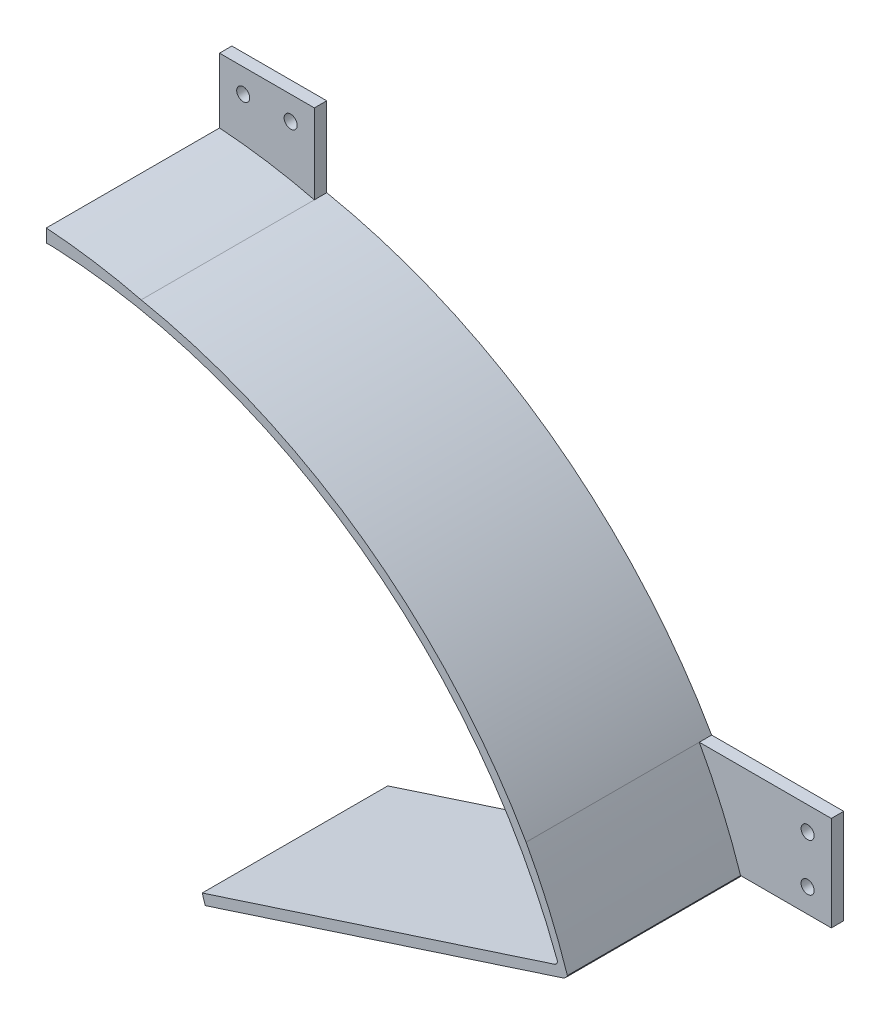
ISO-10303-21;
HEADER;
FILE_DESCRIPTION(('STEP AP214'),'2;1');
FILE_NAME('part.step','',(''),(''),'','','');
FILE_SCHEMA(('AUTOMOTIVE_DESIGN { 1 0 10303 214 1 1 1 1 }'));
ENDSEC;
DATA;
#1=APPLICATION_CONTEXT('core data for automotive mechanical design processes');
#2=APPLICATION_PROTOCOL_DEFINITION('international standard','automotive_design',2000,#1);
#3=PRODUCT_CONTEXT('',#1,'mechanical');
#4=PRODUCT('Part','Part','',(#3));
#5=PRODUCT_RELATED_PRODUCT_CATEGORY('part','',(#4));
#6=PRODUCT_DEFINITION_FORMATION('','',#4);
#7=PRODUCT_DEFINITION_CONTEXT('part definition',#1,'design');
#8=PRODUCT_DEFINITION('design','',#6,#7);
#9=PRODUCT_DEFINITION_SHAPE('','',#8);
#10=(LENGTH_UNIT() NAMED_UNIT(*) SI_UNIT(.MILLI.,.METRE.));
#11=(NAMED_UNIT(*) PLANE_ANGLE_UNIT() SI_UNIT($,.RADIAN.));
#12=(NAMED_UNIT(*) SI_UNIT($,.STERADIAN.) SOLID_ANGLE_UNIT());
#13=UNCERTAINTY_MEASURE_WITH_UNIT(LENGTH_MEASURE(1.E-05),#10,'distance_accuracy_value','');
#14=(GEOMETRIC_REPRESENTATION_CONTEXT(3) GLOBAL_UNCERTAINTY_ASSIGNED_CONTEXT((#13)) GLOBAL_UNIT_ASSIGNED_CONTEXT((#10,
#11,#12)) REPRESENTATION_CONTEXT('',''));
#15=CARTESIAN_POINT('',(0.,0.,0.));
#16=DIRECTION('',(0.,0.,1.));
#17=DIRECTION('',(1.,0.,0.));
#18=AXIS2_PLACEMENT_3D('',#15,#16,#17);
#19=CARTESIAN_POINT('',(-232.100209696536,-162.556464261133,5.));
#20=DIRECTION('',(0.,0.,1.));
#21=DIRECTION('',(1.,0.,0.));
#22=AXIS2_PLACEMENT_3D('',#19,#20,#21);
#23=PLANE('',#22);
#24=CARTESIAN_POINT('',(12.295289669307,-57.5910822865237,5.));
#25=DIRECTION('',(0.,0.,1.));
#26=DIRECTION('',(1.,0.,0.));
#27=AXIS2_PLACEMENT_3D('',#24,#25,#26);
#28=CIRCLE('',#27,2.63563773825907);
#29=CARTESIAN_POINT('',(14.9309274075661,-57.5910822865237,5.));
#30=VERTEX_POINT('',#29);
#31=EDGE_CURVE('E297',#30,#30,#28,.T.);
#32=ORIENTED_EDGE('',*,*,#31,.F.);
#33=EDGE_LOOP('',(#32));
#34=FACE_BOUND('',#33,.T.);
#35=CARTESIAN_POINT('',(12.295289669307,-76.7593567465898,5.));
#36=DIRECTION('',(0.,0.,1.));
#37=DIRECTION('',(1.,0.,0.));
#38=AXIS2_PLACEMENT_3D('',#35,#36,#37);
#39=CIRCLE('',#38,2.63563773825908);
#40=CARTESIAN_POINT('',(14.9309274075661,-76.7593567465898,5.));
#41=VERTEX_POINT('',#40);
#42=EDGE_CURVE('E303',#41,#41,#39,.T.);
#43=ORIENTED_EDGE('',*,*,#42,.F.);
#44=EDGE_LOOP('',(#43));
#45=FACE_BOUND('',#44,.T.);
#46=DIRECTION('',(-1.,0.,0.));
#47=VECTOR('',#46,1.);
#48=CARTESIAN_POINT('',(21.8794268993401,-48.0069450564906,5.));
#49=LINE('',#48,#47);
#50=CARTESIAN_POINT('',(21.8794268993401,-48.0069450564906,5.));
#51=VERTEX_POINT('',#50);
#52=CARTESIAN_POINT('',(-31.4778838614387,-48.0069450564906,5.));
#53=VERTEX_POINT('',#52);
#54=EDGE_CURVE('E319',#51,#53,#49,.T.);
#55=ORIENTED_EDGE('',*,*,#54,.T.);
#56=CARTESIAN_POINT('',(-230.885671829601,-157.575462282154,5.));
#57=DIRECTION('',(0.,0.,1.));
#58=DIRECTION('',(1.,0.,0.));
#59=AXIS2_PLACEMENT_3D('',#56,#57,#58);
#60=CIRCLE('',#59,227.527417840985);
#61=CARTESIAN_POINT('',(-14.7960317246068,-86.3434939766229,5.));
#62=VERTEX_POINT('',#61);
#63=EDGE_CURVE('E184',#53,#62,#60,.F.);
#64=ORIENTED_EDGE('',*,*,#63,.T.);
#65=DIRECTION('',(1.,0.,0.));
#66=VECTOR('',#65,1.);
#67=CARTESIAN_POINT('',(-19.2512494401252,-86.3434939766229,5.));
#68=LINE('',#67,#66);
#69=CARTESIAN_POINT('',(21.8794268993401,-86.3434939766229,5.));
#70=VERTEX_POINT('',#69);
#71=EDGE_CURVE('E88',#62,#70,#68,.T.);
#72=ORIENTED_EDGE('',*,*,#71,.T.);
#73=DIRECTION('',(0.,1.,0.));
#74=VECTOR('',#73,1.);
#75=CARTESIAN_POINT('',(21.8794268993401,-48.0069450564906,5.));
#76=LINE('',#75,#74);
#77=EDGE_CURVE('E317',#70,#51,#76,.T.);
#78=ORIENTED_EDGE('',*,*,#77,.T.);
#79=EDGE_LOOP('',(#55,#64,#72,#78));
#80=FACE_BOUND('',#79,.T.);
#81=ADVANCED_FACE('F39',(#34,#45,#80),#23,.T.);
#82=DIRECTION('',(0.,-1.,0.));
#83=VECTOR('',#82,1.);
#84=CARTESIAN_POINT('',(-225.391313635513,64.7579829150162,5.));
#85=LINE('',#84,#83);
#86=CARTESIAN_POINT('',(-225.391313635513,96.21524094976,5.));
#87=VERTEX_POINT('',#86);
#88=CARTESIAN_POINT('',(-225.391313635513,70.0322881605736,5.));
#89=VERTEX_POINT('',#88);
#90=EDGE_CURVE('E231',#87,#89,#85,.T.);
#91=ORIENTED_EDGE('',*,*,#90,.T.);
#92=CARTESIAN_POINT('',(-241.284731317854,-156.939351353619,5.));
#93=DIRECTION('',(0.,0.,1.));
#94=DIRECTION('',(1.,0.,0.));
#95=AXIS2_PLACEMENT_3D('',#92,#93,#94);
#96=CIRCLE('',#95,227.527417840985);
#97=CARTESIAN_POINT('',(-187.054764715381,64.0308651726825,5.));
#98=VERTEX_POINT('',#97);
#99=EDGE_CURVE('E278',#89,#98,#96,.F.);
#100=ORIENTED_EDGE('',*,*,#99,.T.);
#101=DIRECTION('',(0.,1.,0.));
#102=VECTOR('',#101,1.);
#103=CARTESIAN_POINT('',(-187.054764715381,96.2152409497599,5.));
#104=LINE('',#103,#102);
#105=CARTESIAN_POINT('',(-187.054764715381,96.2152409497599,5.));
#106=VERTEX_POINT('',#105);
#107=EDGE_CURVE('E322',#98,#106,#104,.T.);
#108=ORIENTED_EDGE('',*,*,#107,.T.);
#109=DIRECTION('',(-1.,0.,0.));
#110=VECTOR('',#109,1.);
#111=CARTESIAN_POINT('',(-225.391313635513,96.21524094976,5.));
#112=LINE('',#111,#110);
#113=EDGE_CURVE('E56',#106,#87,#112,.T.);
#114=ORIENTED_EDGE('',*,*,#113,.T.);
#115=EDGE_LOOP('',(#91,#100,#108,#114));
#116=FACE_BOUND('',#115,.T.);
#117=CARTESIAN_POINT('',(-215.80717640548,86.6311037197273,5.));
#118=DIRECTION('',(0.,0.,1.));
#119=DIRECTION('',(1.,0.,0.));
#120=AXIS2_PLACEMENT_3D('',#117,#118,#119);
#121=CIRCLE('',#120,2.63563773825912);
#122=CARTESIAN_POINT('',(-213.171538667221,86.6311037197273,5.));
#123=VERTEX_POINT('',#122);
#124=EDGE_CURVE('E223',#123,#123,#121,.T.);
#125=ORIENTED_EDGE('',*,*,#124,.F.);
#126=EDGE_LOOP('',(#125));
#127=FACE_BOUND('',#126,.T.);
#128=CARTESIAN_POINT('',(-196.638901945414,86.6311037197273,5.));
#129=DIRECTION('',(0.,0.,1.));
#130=DIRECTION('',(1.,0.,0.));
#131=AXIS2_PLACEMENT_3D('',#128,#129,#130);
#132=CIRCLE('',#131,2.63563773825909);
#133=CARTESIAN_POINT('',(-194.003264207155,86.6311037197273,5.));
#134=VERTEX_POINT('',#133);
#135=EDGE_CURVE('E309',#134,#134,#132,.T.);
#136=ORIENTED_EDGE('',*,*,#135,.F.);
#137=EDGE_LOOP('',(#136));
#138=FACE_BOUND('',#137,.T.);
#139=ADVANCED_FACE('F323',(#116,#127,#138),#23,.T.);
#140=CARTESIAN_POINT('',(-232.100209696536,-162.556464261133,0.));
#141=DIRECTION('',(0.,0.,1.));
#142=DIRECTION('',(1.,0.,0.));
#143=AXIS2_PLACEMENT_3D('',#140,#141,#142);
#144=PLANE('',#143);
#145=DIRECTION('',(-1.,0.,0.));
#146=VECTOR('',#145,1.);
#147=CARTESIAN_POINT('',(-225.391313635513,96.21524094976,0.));
#148=LINE('',#147,#146);
#149=CARTESIAN_POINT('',(-187.054764715381,96.2152409497599,0.));
#150=VERTEX_POINT('',#149);
#151=CARTESIAN_POINT('',(-225.391313635513,96.21524094976,0.));
#152=VERTEX_POINT('',#151);
#153=EDGE_CURVE('E80',#150,#152,#148,.T.);
#154=ORIENTED_EDGE('',*,*,#153,.F.);
#155=DIRECTION('',(0.,1.,0.));
#156=VECTOR('',#155,1.);
#157=CARTESIAN_POINT('',(-187.054764715381,96.2152409497599,0.));
#158=LINE('',#157,#156);
#159=CARTESIAN_POINT('',(-187.054764715381,64.0308651726825,0.));
#160=VERTEX_POINT('',#159);
#161=EDGE_CURVE('E74',#160,#150,#158,.T.);
#162=ORIENTED_EDGE('',*,*,#161,.F.);
#163=CARTESIAN_POINT('',(-232.100209696536,-162.556464261133,0.));
#164=DIRECTION('',(0.,0.,1.));
#165=DIRECTION('',(1.,0.,0.));
#166=AXIS2_PLACEMENT_3D('',#163,#164,#165);
#167=CIRCLE('',#166,231.021449163273);
#168=CARTESIAN_POINT('',(-31.4778838614387,-48.0069450564906,0.));
#169=VERTEX_POINT('',#168);
#170=EDGE_CURVE('E339',#160,#169,#167,.F.);
#171=ORIENTED_EDGE('',*,*,#170,.T.);
#172=DIRECTION('',(-1.,0.,0.));
#173=VECTOR('',#172,1.);
#174=CARTESIAN_POINT('',(21.8794268993401,-48.0069450564906,0.));
#175=LINE('',#174,#173);
#176=CARTESIAN_POINT('',(21.8794268993401,-48.0069450564906,0.));
#177=VERTEX_POINT('',#176);
#178=EDGE_CURVE('E225',#177,#169,#175,.T.);
#179=ORIENTED_EDGE('',*,*,#178,.F.);
#180=DIRECTION('',(0.,1.,0.));
#181=VECTOR('',#180,1.);
#182=CARTESIAN_POINT('',(21.8794268993401,-48.0069450564906,0.));
#183=LINE('',#182,#181);
#184=CARTESIAN_POINT('',(21.8794268993401,-86.3434939766229,0.));
#185=VERTEX_POINT('',#184);
#186=EDGE_CURVE('E222',#185,#177,#183,.T.);
#187=ORIENTED_EDGE('',*,*,#186,.F.);
#188=DIRECTION('',(1.,0.,0.));
#189=VECTOR('',#188,1.);
#190=CARTESIAN_POINT('',(-19.2512494401252,-86.3434939766229,0.));
#191=LINE('',#190,#189);
#192=CARTESIAN_POINT('',(-14.7960317246068,-86.3434939766229,0.));
#193=VERTEX_POINT('',#192);
#194=EDGE_CURVE('E212',#193,#185,#191,.T.);
#195=ORIENTED_EDGE('',*,*,#194,.F.);
#196=CARTESIAN_POINT('',(-17.5863496373822,-85.2416201428085,0.));
#197=DIRECTION('',(0.,0.,1.));
#198=DIRECTION('',(1.,0.,0.));
#199=AXIS2_PLACEMENT_3D('',#196,#197,#198);
#200=CIRCLE('',#199,3.);
#201=CARTESIAN_POINT('',(-16.6592986542574,-88.094789691694,0.));
#202=VERTEX_POINT('',#201);
#203=EDGE_CURVE('E11',#193,#202,#200,.F.);
#204=ORIENTED_EDGE('',*,*,#203,.T.);
#205=DIRECTION('',(-0.951056516295154,-0.309016994374948,0.));
#206=VECTOR('',#205,1.);
#207=CARTESIAN_POINT('',(24.2995876279946,-74.7864408028264,0.));
#208=LINE('',#207,#206);
#209=CARTESIAN_POINT('',(-161.147524711779,-135.041860211535,0.));
#210=VERTEX_POINT('',#209);
#211=EDGE_CURVE('E758',#202,#210,#208,.T.);
#212=ORIENTED_EDGE('',*,*,#211,.T.);
#213=DIRECTION('',(0.309016994374937,-0.951056516295157,0.));
#214=VECTOR('',#213,1.);
#215=CARTESIAN_POINT('',(-162.383592689279,-131.237634146355,0.));
#216=LINE('',#215,#214);
#217=CARTESIAN_POINT('',(-162.383592689279,-131.237634146355,0.));
#218=VERTEX_POINT('',#217);
#219=EDGE_CURVE('E757',#218,#210,#216,.T.);
#220=ORIENTED_EDGE('',*,*,#219,.F.);
#221=DIRECTION('',(-0.951056516295154,-0.309016994374948,0.));
#222=VECTOR('',#221,1.);
#223=CARTESIAN_POINT('',(-19.9153960464995,-84.946910970333,0.));
#224=LINE('',#223,#222);
#225=CARTESIAN_POINT('',(-19.9153960464995,-84.946910970333,0.));
#226=VERTEX_POINT('',#225);
#227=EDGE_CURVE('E767',#226,#218,#224,.T.);
#228=ORIENTED_EDGE('',*,*,#227,.F.);
#229=CARTESIAN_POINT('',(-20.3892618513798,-83.4885019838226,0.));
#230=DIRECTION('',(0.,0.,1.));
#231=DIRECTION('',(1.,0.,0.));
#232=AXIS2_PLACEMENT_3D('',#229,#230,#231);
#233=CIRCLE('',#232,1.53346195680532);
#234=CARTESIAN_POINT('',(-18.9527159796569,-82.9519933339341,0.));
#235=VERTEX_POINT('',#234);
#236=EDGE_CURVE('E248',#235,#226,#233,.F.);
#237=ORIENTED_EDGE('',*,*,#236,.F.);
#238=CARTESIAN_POINT('',(-232.100209696536,-162.556464261133,0.));
#239=DIRECTION('',(0.,0.,1.));
#240=DIRECTION('',(1.,0.,0.));
#241=AXIS2_PLACEMENT_3D('',#238,#239,#240);
#242=CIRCLE('',#241,227.527417840985);
#243=CARTESIAN_POINT('',(-222.258056761939,64.7579829150162,0.));
#244=VERTEX_POINT('',#243);
#245=EDGE_CURVE('E181',#244,#235,#242,.F.);
#246=ORIENTED_EDGE('',*,*,#245,.F.);
#247=DIRECTION('',(1.,0.,0.));
#248=VECTOR('',#247,1.);
#249=CARTESIAN_POINT('',(-225.391313635513,64.7579829150162,0.));
#250=LINE('',#249,#248);
#251=CARTESIAN_POINT('',(-225.391313635513,64.7579829150162,0.));
#252=VERTEX_POINT('',#251);
#253=EDGE_CURVE('E177',#252,#244,#250,.T.);
#254=ORIENTED_EDGE('',*,*,#253,.F.);
#255=DIRECTION('',(0.,-1.,0.));
#256=VECTOR('',#255,1.);
#257=CARTESIAN_POINT('',(-225.391313635513,64.7579829150162,0.));
#258=LINE('',#257,#256);
#259=EDGE_CURVE('E165',#152,#252,#258,.T.);
#260=ORIENTED_EDGE('',*,*,#259,.F.);
#261=EDGE_LOOP('',(#154,#162,#171,#179,#187,#195,#204,#212,#220,#228,#237,#246,#254,#260));
#262=FACE_BOUND('',#261,.T.);
#263=CARTESIAN_POINT('',(-215.80717640548,86.6311037197273,0.));
#264=DIRECTION('',(0.,0.,1.));
#265=DIRECTION('',(1.,0.,0.));
#266=AXIS2_PLACEMENT_3D('',#263,#264,#265);
#267=CIRCLE('',#266,2.63563773825912);
#268=CARTESIAN_POINT('',(-213.171538667221,86.6311037197273,0.));
#269=VERTEX_POINT('',#268);
#270=EDGE_CURVE('E228',#269,#269,#267,.T.);
#271=ORIENTED_EDGE('',*,*,#270,.T.);
#272=EDGE_LOOP('',(#271));
#273=FACE_BOUND('',#272,.T.);
#274=CARTESIAN_POINT('',(-196.638901945414,86.6311037197273,0.));
#275=DIRECTION('',(0.,0.,1.));
#276=DIRECTION('',(1.,0.,0.));
#277=AXIS2_PLACEMENT_3D('',#274,#275,#276);
#278=CIRCLE('',#277,2.63563773825909);
#279=CARTESIAN_POINT('',(-194.003264207155,86.6311037197273,0.));
#280=VERTEX_POINT('',#279);
#281=EDGE_CURVE('E306',#280,#280,#278,.T.);
#282=ORIENTED_EDGE('',*,*,#281,.T.);
#283=EDGE_LOOP('',(#282));
#284=FACE_BOUND('',#283,.T.);
#285=CARTESIAN_POINT('',(12.295289669307,-57.5910822865237,0.));
#286=DIRECTION('',(0.,0.,1.));
#287=DIRECTION('',(1.,0.,0.));
#288=AXIS2_PLACEMENT_3D('',#285,#286,#287);
#289=CIRCLE('',#288,2.63563773825907);
#290=CARTESIAN_POINT('',(14.9309274075661,-57.5910822865237,0.));
#291=VERTEX_POINT('',#290);
#292=EDGE_CURVE('E296',#291,#291,#289,.T.);
#293=ORIENTED_EDGE('',*,*,#292,.T.);
#294=EDGE_LOOP('',(#293));
#295=FACE_BOUND('',#294,.T.);
#296=CARTESIAN_POINT('',(12.295289669307,-76.7593567465898,0.));
#297=DIRECTION('',(0.,0.,1.));
#298=DIRECTION('',(1.,0.,0.));
#299=AXIS2_PLACEMENT_3D('',#296,#297,#298);
#300=CIRCLE('',#299,2.63563773825908);
#301=CARTESIAN_POINT('',(14.9309274075661,-76.7593567465898,0.));
#302=VERTEX_POINT('',#301);
#303=EDGE_CURVE('E300',#302,#302,#300,.T.);
#304=ORIENTED_EDGE('',*,*,#303,.T.);
#305=EDGE_LOOP('',(#304));
#306=FACE_BOUND('',#305,.T.);
#307=ADVANCED_FACE('F178',(#262,#273,#284,#295,#306),#144,.F.);
#308=CARTESIAN_POINT('',(-19.2512494401252,-86.3434939766229,5.));
#309=DIRECTION('',(0.,1.,0.));
#310=DIRECTION('',(-1.,0.,0.));
#311=AXIS2_PLACEMENT_3D('',#308,#309,#310);
#312=PLANE('',#311);
#313=ORIENTED_EDGE('',*,*,#71,.F.);
#314=DIRECTION('',(0.,0.,1.));
#315=VECTOR('',#314,1.);
#316=CARTESIAN_POINT('',(-14.7960317246068,-86.3434939766229,5.));
#317=LINE('',#316,#315);
#318=EDGE_CURVE('E48',#62,#193,#317,.F.);
#319=ORIENTED_EDGE('',*,*,#318,.T.);
#320=ORIENTED_EDGE('',*,*,#194,.T.);
#321=DIRECTION('',(0.,0.,-1.));
#322=VECTOR('',#321,1.);
#323=CARTESIAN_POINT('',(21.8794268993401,-86.3434939766229,5.));
#324=LINE('',#323,#322);
#325=EDGE_CURVE('E202',#70,#185,#324,.T.);
#326=ORIENTED_EDGE('',*,*,#325,.F.);
#327=EDGE_LOOP('',(#313,#319,#320,#326));
#328=FACE_BOUND('',#327,.T.);
#329=ADVANCED_FACE('F209',(#328),#312,.F.);
#330=CARTESIAN_POINT('',(21.8794268993401,-48.0069450564906,5.));
#331=DIRECTION('',(-1.,0.,0.));
#332=DIRECTION('',(0.,0.,1.));
#333=AXIS2_PLACEMENT_3D('',#330,#331,#332);
#334=PLANE('',#333);
#335=ORIENTED_EDGE('',*,*,#186,.T.);
#336=DIRECTION('',(0.,0.,-1.));
#337=VECTOR('',#336,1.);
#338=CARTESIAN_POINT('',(21.8794268993401,-48.0069450564906,5.));
#339=LINE('',#338,#337);
#340=EDGE_CURVE('E199',#51,#177,#339,.T.);
#341=ORIENTED_EDGE('',*,*,#340,.F.);
#342=ORIENTED_EDGE('',*,*,#77,.F.);
#343=ORIENTED_EDGE('',*,*,#325,.T.);
#344=EDGE_LOOP('',(#335,#341,#342,#343));
#345=FACE_BOUND('',#344,.T.);
#346=ADVANCED_FACE('F458',(#345),#334,.F.);
#347=CARTESIAN_POINT('',(21.8794268993401,-48.0069450564906,5.));
#348=DIRECTION('',(0.,-1.,0.));
#349=DIRECTION('',(1.,0.,0.));
#350=AXIS2_PLACEMENT_3D('',#347,#348,#349);
#351=PLANE('',#350);
#352=ORIENTED_EDGE('',*,*,#178,.T.);
#353=DIRECTION('',(0.,0.,1.));
#354=VECTOR('',#353,1.);
#355=CARTESIAN_POINT('',(-31.4778838614387,-48.0069450564906,-65.));
#356=LINE('',#355,#354);
#357=EDGE_CURVE('E293',#169,#53,#356,.T.);
#358=ORIENTED_EDGE('',*,*,#357,.T.);
#359=ORIENTED_EDGE('',*,*,#54,.F.);
#360=ORIENTED_EDGE('',*,*,#340,.T.);
#361=EDGE_LOOP('',(#352,#358,#359,#360));
#362=FACE_BOUND('',#361,.T.);
#363=ADVANCED_FACE('F351',(#362),#351,.F.);
#364=CARTESIAN_POINT('',(-187.054764715381,96.2152409497599,5.));
#365=DIRECTION('',(-1.,0.,0.));
#366=DIRECTION('',(0.,0.,1.));
#367=AXIS2_PLACEMENT_3D('',#364,#365,#366);
#368=PLANE('',#367);
#369=ORIENTED_EDGE('',*,*,#107,.F.);
#370=DIRECTION('',(0.,0.,1.));
#371=VECTOR('',#370,1.);
#372=CARTESIAN_POINT('',(-187.054764715381,64.0308651726825,-65.));
#373=LINE('',#372,#371);
#374=EDGE_CURVE('E291',#98,#160,#373,.F.);
#375=ORIENTED_EDGE('',*,*,#374,.T.);
#376=ORIENTED_EDGE('',*,*,#161,.T.);
#377=DIRECTION('',(0.,0.,-1.));
#378=VECTOR('',#377,1.);
#379=CARTESIAN_POINT('',(-187.054764715381,96.2152409497599,5.));
#380=LINE('',#379,#378);
#381=EDGE_CURVE('E192',#106,#150,#380,.T.);
#382=ORIENTED_EDGE('',*,*,#381,.F.);
#383=EDGE_LOOP('',(#369,#375,#376,#382));
#384=FACE_BOUND('',#383,.T.);
#385=ADVANCED_FACE('F340',(#384),#368,.F.);
#386=CARTESIAN_POINT('',(-225.391313635513,96.21524094976,5.));
#387=DIRECTION('',(0.,-1.,0.));
#388=DIRECTION('',(1.,0.,0.));
#389=AXIS2_PLACEMENT_3D('',#386,#387,#388);
#390=PLANE('',#389);
#391=ORIENTED_EDGE('',*,*,#153,.T.);
#392=DIRECTION('',(0.,0.,-1.));
#393=VECTOR('',#392,1.);
#394=CARTESIAN_POINT('',(-225.391313635513,96.21524094976,5.));
#395=LINE('',#394,#393);
#396=EDGE_CURVE('E173',#87,#152,#395,.T.);
#397=ORIENTED_EDGE('',*,*,#396,.F.);
#398=ORIENTED_EDGE('',*,*,#113,.F.);
#399=ORIENTED_EDGE('',*,*,#381,.T.);
#400=EDGE_LOOP('',(#391,#397,#398,#399));
#401=FACE_BOUND('',#400,.T.);
#402=ADVANCED_FACE('F341',(#401),#390,.F.);
#403=CARTESIAN_POINT('',(-225.391313635513,64.7579829150162,5.));
#404=DIRECTION('',(1.,0.,0.));
#405=DIRECTION('',(0.,0.,-1.));
#406=AXIS2_PLACEMENT_3D('',#403,#404,#405);
#407=PLANE('',#406);
#408=ORIENTED_EDGE('',*,*,#259,.T.);
#409=DIRECTION('',(0.,0.,-1.));
#410=VECTOR('',#409,1.);
#411=CARTESIAN_POINT('',(-225.391313635513,64.7579829150162,5.));
#412=LINE('',#411,#410);
#413=CARTESIAN_POINT('',(-225.391313635513,64.7579829150162,75.));
#414=VERTEX_POINT('',#413);
#415=EDGE_CURVE('E170',#414,#252,#412,.T.);
#416=ORIENTED_EDGE('',*,*,#415,.F.);
#417=DIRECTION('',(0.,-1.,0.));
#418=VECTOR('',#417,1.);
#419=CARTESIAN_POINT('',(-225.391313635513,0.,75.));
#420=LINE('',#419,#418);
#421=CARTESIAN_POINT('',(-225.391313635513,70.0322881605736,75.));
#422=VERTEX_POINT('',#421);
#423=EDGE_CURVE('E264',#422,#414,#420,.T.);
#424=ORIENTED_EDGE('',*,*,#423,.F.);
#425=DIRECTION('',(0.,0.,-1.));
#426=VECTOR('',#425,1.);
#427=CARTESIAN_POINT('',(-225.391313635513,70.0322881605736,75.));
#428=LINE('',#427,#426);
#429=EDGE_CURVE('E283',#422,#89,#428,.T.);
#430=ORIENTED_EDGE('',*,*,#429,.T.);
#431=ORIENTED_EDGE('',*,*,#90,.F.);
#432=ORIENTED_EDGE('',*,*,#396,.T.);
#433=EDGE_LOOP('',(#408,#416,#424,#430,#431,#432));
#434=FACE_BOUND('',#433,.T.);
#435=ADVANCED_FACE('F167',(#434),#407,.F.);
#436=CARTESIAN_POINT('',(-225.391313635513,64.7579829150162,5.));
#437=DIRECTION('',(0.,1.,0.));
#438=DIRECTION('',(0.,0.,1.));
#439=AXIS2_PLACEMENT_3D('',#436,#437,#438);
#440=PLANE('',#439);
#441=ORIENTED_EDGE('',*,*,#415,.T.);
#442=ORIENTED_EDGE('',*,*,#253,.T.);
#443=DIRECTION('',(0.,0.,-1.));
#444=VECTOR('',#443,1.);
#445=CARTESIAN_POINT('',(-222.258056761939,64.7579829150162,5.));
#446=LINE('',#445,#444);
#447=CARTESIAN_POINT('',(-222.258056761939,64.7579829150162,75.));
#448=VERTEX_POINT('',#447);
#449=EDGE_CURVE('E190',#448,#244,#446,.T.);
#450=ORIENTED_EDGE('',*,*,#449,.F.);
#451=DIRECTION('',(1.,0.,0.));
#452=VECTOR('',#451,1.);
#453=CARTESIAN_POINT('',(0.,64.7579829150162,75.));
#454=LINE('',#453,#452);
#455=EDGE_CURVE('E189',#414,#448,#454,.T.);
#456=ORIENTED_EDGE('',*,*,#455,.F.);
#457=EDGE_LOOP('',(#441,#442,#450,#456));
#458=FACE_BOUND('',#457,.T.);
#459=ADVANCED_FACE('F187',(#458),#440,.F.);
#460=CARTESIAN_POINT('',(-232.100209696536,-162.556464261133,5.));
#461=DIRECTION('',(0.,0.,-1.));
#462=DIRECTION('',(-1.,0.,0.));
#463=AXIS2_PLACEMENT_3D('',#460,#461,#462);
#464=CYLINDRICAL_SURFACE('',#463,227.527417840985);
#465=ORIENTED_EDGE('',*,*,#449,.T.);
#466=ORIENTED_EDGE('',*,*,#245,.T.);
#467=DIRECTION('',(0.,0.,-1.));
#468=VECTOR('',#467,1.);
#469=CARTESIAN_POINT('',(-18.9527159796569,-82.9519933339341,5.));
#470=LINE('',#469,#468);
#471=CARTESIAN_POINT('',(-18.9527159796569,-82.9519933339341,75.));
#472=VERTEX_POINT('',#471);
#473=EDGE_CURVE('E194',#472,#235,#470,.T.);
#474=ORIENTED_EDGE('',*,*,#473,.F.);
#475=CARTESIAN_POINT('',(-232.100209696536,-162.556464261133,75.));
#476=DIRECTION('',(0.,0.,1.));
#477=DIRECTION('',(1.,0.,0.));
#478=AXIS2_PLACEMENT_3D('',#475,#476,#477);
#479=CIRCLE('',#478,227.527417840985);
#480=EDGE_CURVE('E255',#448,#472,#479,.F.);
#481=ORIENTED_EDGE('',*,*,#480,.F.);
#482=EDGE_LOOP('',(#465,#466,#474,#481));
#483=FACE_BOUND('',#482,.T.);
#484=ADVANCED_FACE('F254',(#483),#464,.F.);
#485=CARTESIAN_POINT('',(-20.3892618513798,-83.4885019838226,5.));
#486=DIRECTION('',(0.,0.,-1.));
#487=DIRECTION('',(-1.,0.,0.));
#488=AXIS2_PLACEMENT_3D('',#485,#486,#487);
#489=CYLINDRICAL_SURFACE('',#488,1.53346195680532);
#490=ORIENTED_EDGE('',*,*,#473,.T.);
#491=ORIENTED_EDGE('',*,*,#236,.T.);
#492=DIRECTION('',(0.,0.,-1.));
#493=VECTOR('',#492,1.);
#494=CARTESIAN_POINT('',(-19.9153960464995,-84.946910970333,5.));
#495=LINE('',#494,#493);
#496=CARTESIAN_POINT('',(-19.9153960464995,-84.946910970333,75.));
#497=VERTEX_POINT('',#496);
#498=EDGE_CURVE('E241',#497,#226,#495,.T.);
#499=ORIENTED_EDGE('',*,*,#498,.F.);
#500=CARTESIAN_POINT('',(-20.3892618513798,-83.4885019838226,75.));
#501=DIRECTION('',(0.,0.,1.));
#502=DIRECTION('',(1.,0.,0.));
#503=AXIS2_PLACEMENT_3D('',#500,#501,#502);
#504=CIRCLE('',#503,1.53346195680532);
#505=EDGE_CURVE('E250',#472,#497,#504,.F.);
#506=ORIENTED_EDGE('',*,*,#505,.F.);
#507=EDGE_LOOP('',(#490,#491,#499,#506));
#508=FACE_BOUND('',#507,.T.);
#509=ADVANCED_FACE('F247',(#508),#489,.F.);
#510=CARTESIAN_POINT('',(-19.9153960464995,-84.946910970333,5.));
#511=DIRECTION('',(0.309016994374948,-0.951056516295153,0.));
#512=DIRECTION('',(0.951056516295154,0.309016994374948,0.));
#513=AXIS2_PLACEMENT_3D('',#510,#511,#512);
#514=PLANE('',#513);
#515=ORIENTED_EDGE('',*,*,#498,.T.);
#516=ORIENTED_EDGE('',*,*,#227,.T.);
#517=DIRECTION('',(0.,0.,-1.));
#518=VECTOR('',#517,1.);
#519=CARTESIAN_POINT('',(-162.383592689279,-131.237634146355,5.));
#520=LINE('',#519,#518);
#521=CARTESIAN_POINT('',(-162.383592689279,-131.237634146355,75.));
#522=VERTEX_POINT('',#521);
#523=EDGE_CURVE('E238',#522,#218,#520,.T.);
#524=ORIENTED_EDGE('',*,*,#523,.F.);
#525=DIRECTION('',(-0.951056516295154,-0.309016994374948,0.));
#526=VECTOR('',#525,1.);
#527=CARTESIAN_POINT('',(23.0635196504949,-70.9822147376458,75.));
#528=LINE('',#527,#526);
#529=EDGE_CURVE('E262',#497,#522,#528,.T.);
#530=ORIENTED_EDGE('',*,*,#529,.F.);
#531=EDGE_LOOP('',(#515,#516,#524,#530));
#532=FACE_BOUND('',#531,.T.);
#533=ADVANCED_FACE('F371',(#532),#514,.F.);
#534=CARTESIAN_POINT('',(-162.383592689279,-131.237634146355,5.));
#535=DIRECTION('',(0.951056516295157,0.309016994374937,0.));
#536=DIRECTION('',(-0.309016994374937,0.951056516295157,0.));
#537=AXIS2_PLACEMENT_3D('',#534,#535,#536);
#538=PLANE('',#537);
#539=ORIENTED_EDGE('',*,*,#523,.T.);
#540=ORIENTED_EDGE('',*,*,#219,.T.);
#541=DIRECTION('',(0.,0.,1.));
#542=VECTOR('',#541,1.);
#543=CARTESIAN_POINT('',(-161.147524711779,-135.041860211535,-65.));
#544=LINE('',#543,#542);
#545=CARTESIAN_POINT('',(-161.147524711779,-135.041860211535,75.));
#546=VERTEX_POINT('',#545);
#547=EDGE_CURVE('E289',#210,#546,#544,.T.);
#548=ORIENTED_EDGE('',*,*,#547,.T.);
#549=DIRECTION('',(0.309016994374937,-0.951056516295157,0.));
#550=VECTOR('',#549,1.);
#551=CARTESIAN_POINT('',(-185.447112339773,-60.2554194087067,75.));
#552=LINE('',#551,#550);
#553=EDGE_CURVE('E269',#522,#546,#552,.T.);
#554=ORIENTED_EDGE('',*,*,#553,.F.);
#555=EDGE_LOOP('',(#539,#540,#548,#554));
#556=FACE_BOUND('',#555,.T.);
#557=ADVANCED_FACE('F368',(#556),#538,.F.);
#558=CARTESIAN_POINT('',(-215.80717640548,86.6311037197273,5.));
#559=DIRECTION('',(0.,0.,-1.));
#560=DIRECTION('',(-1.,0.,0.));
#561=AXIS2_PLACEMENT_3D('',#558,#559,#560);
#562=CYLINDRICAL_SURFACE('',#561,2.63563773825912);
#563=ORIENTED_EDGE('',*,*,#124,.T.);
#564=EDGE_LOOP('',(#563));
#565=FACE_BOUND('',#564,.T.);
#566=ORIENTED_EDGE('',*,*,#270,.F.);
#567=EDGE_LOOP('',(#566));
#568=FACE_BOUND('',#567,.T.);
#569=ADVANCED_FACE('F364',(#565,#568),#562,.F.);
#570=CARTESIAN_POINT('',(-196.638901945414,86.6311037197273,5.));
#571=DIRECTION('',(0.,0.,-1.));
#572=DIRECTION('',(-1.,0.,0.));
#573=AXIS2_PLACEMENT_3D('',#570,#571,#572);
#574=CYLINDRICAL_SURFACE('',#573,2.63563773825909);
#575=ORIENTED_EDGE('',*,*,#135,.T.);
#576=EDGE_LOOP('',(#575));
#577=FACE_BOUND('',#576,.T.);
#578=ORIENTED_EDGE('',*,*,#281,.F.);
#579=EDGE_LOOP('',(#578));
#580=FACE_BOUND('',#579,.T.);
#581=ADVANCED_FACE('F586',(#577,#580),#574,.F.);
#582=CARTESIAN_POINT('',(12.295289669307,-76.7593567465898,5.));
#583=DIRECTION('',(0.,0.,-1.));
#584=DIRECTION('',(-1.,0.,0.));
#585=AXIS2_PLACEMENT_3D('',#582,#583,#584);
#586=CYLINDRICAL_SURFACE('',#585,2.63563773825908);
#587=ORIENTED_EDGE('',*,*,#42,.T.);
#588=EDGE_LOOP('',(#587));
#589=FACE_BOUND('',#588,.T.);
#590=ORIENTED_EDGE('',*,*,#303,.F.);
#591=EDGE_LOOP('',(#590));
#592=FACE_BOUND('',#591,.T.);
#593=ADVANCED_FACE('F576',(#589,#592),#586,.F.);
#594=CARTESIAN_POINT('',(12.295289669307,-57.5910822865237,5.));
#595=DIRECTION('',(0.,0.,-1.));
#596=DIRECTION('',(-1.,0.,0.));
#597=AXIS2_PLACEMENT_3D('',#594,#595,#596);
#598=CYLINDRICAL_SURFACE('',#597,2.63563773825907);
#599=ORIENTED_EDGE('',*,*,#31,.T.);
#600=EDGE_LOOP('',(#599));
#601=FACE_BOUND('',#600,.T.);
#602=ORIENTED_EDGE('',*,*,#292,.F.);
#603=EDGE_LOOP('',(#602));
#604=FACE_BOUND('',#603,.T.);
#605=ADVANCED_FACE('F408',(#601,#604),#598,.F.);
#606=CARTESIAN_POINT('',(-232.100209696536,-162.556464261133,-65.));
#607=DIRECTION('',(0.,0.,1.));
#608=DIRECTION('',(1.,0.,0.));
#609=AXIS2_PLACEMENT_3D('',#606,#607,#608);
#610=CYLINDRICAL_SURFACE('',#609,231.021449163273);
#611=ORIENTED_EDGE('',*,*,#170,.F.);
#612=ORIENTED_EDGE('',*,*,#374,.F.);
#613=DIRECTION('',(0.,0.,-1.));
#614=VECTOR('',#613,1.);
#615=CARTESIAN_POINT('',(-187.054764715381,64.0308651726825,75.));
#616=LINE('',#615,#614);
#617=CARTESIAN_POINT('',(-187.054764715381,64.0308651726825,75.));
#618=VERTEX_POINT('',#617);
#619=EDGE_CURVE('E285',#618,#98,#616,.T.);
#620=ORIENTED_EDGE('',*,*,#619,.F.);
#621=CARTESIAN_POINT('',(-232.100209696536,-162.556464261133,75.));
#622=DIRECTION('',(0.,0.,1.));
#623=DIRECTION('',(1.,0.,0.));
#624=AXIS2_PLACEMENT_3D('',#621,#622,#623);
#625=CIRCLE('',#624,231.021449163273);
#626=CARTESIAN_POINT('',(-31.4778838614387,-48.0069450564906,75.));
#627=VERTEX_POINT('',#626);
#628=EDGE_CURVE('E336',#627,#618,#625,.T.);
#629=ORIENTED_EDGE('',*,*,#628,.F.);
#630=DIRECTION('',(0.,0.,-1.));
#631=VECTOR('',#630,1.);
#632=CARTESIAN_POINT('',(-31.4778838614387,-48.0069450564906,75.));
#633=LINE('',#632,#631);
#634=EDGE_CURVE('E287',#627,#53,#633,.T.);
#635=ORIENTED_EDGE('',*,*,#634,.T.);
#636=ORIENTED_EDGE('',*,*,#357,.F.);
#637=EDGE_LOOP('',(#611,#612,#620,#629,#635,#636));
#638=FACE_BOUND('',#637,.T.);
#639=ADVANCED_FACE('F335',(#638),#610,.T.);
#640=CARTESIAN_POINT('',(24.2995876279946,-74.7864408028264,-65.));
#641=DIRECTION('',(0.309016994374948,-0.951056516295154,0.));
#642=DIRECTION('',(0.951056516295154,0.309016994374948,0.));
#643=AXIS2_PLACEMENT_3D('',#640,#641,#642);
#644=PLANE('',#643);
#645=ORIENTED_EDGE('',*,*,#211,.F.);
#646=DIRECTION('',(0.,0.,1.));
#647=VECTOR('',#646,1.);
#648=CARTESIAN_POINT('',(-16.6592986542573,-88.0947896916939,-65.));
#649=LINE('',#648,#647);
#650=CARTESIAN_POINT('',(-16.6592986542574,-88.094789691694,75.));
#651=VERTEX_POINT('',#650);
#652=EDGE_CURVE('E205',#202,#651,#649,.T.);
#653=ORIENTED_EDGE('',*,*,#652,.T.);
#654=DIRECTION('',(0.951056516295154,0.309016994374948,0.));
#655=VECTOR('',#654,1.);
#656=CARTESIAN_POINT('',(24.2995876279947,-74.7864408028265,75.));
#657=LINE('',#656,#655);
#658=EDGE_CURVE('E272',#546,#651,#657,.T.);
#659=ORIENTED_EDGE('',*,*,#658,.F.);
#660=ORIENTED_EDGE('',*,*,#547,.F.);
#661=EDGE_LOOP('',(#645,#653,#659,#660));
#662=FACE_BOUND('',#661,.T.);
#663=ADVANCED_FACE('F407',(#662),#644,.T.);
#664=CARTESIAN_POINT('',(-17.5863496373822,-85.2416201428085,-65.));
#665=DIRECTION('',(0.,0.,1.));
#666=DIRECTION('',(1.,0.,0.));
#667=AXIS2_PLACEMENT_3D('',#664,#665,#666);
#668=CYLINDRICAL_SURFACE('',#667,3.);
#669=ORIENTED_EDGE('',*,*,#203,.F.);
#670=ORIENTED_EDGE('',*,*,#318,.F.);
#671=DIRECTION('',(0.,0.,-1.));
#672=VECTOR('',#671,1.);
#673=CARTESIAN_POINT('',(-14.7960317246068,-86.3434939766229,75.));
#674=LINE('',#673,#672);
#675=CARTESIAN_POINT('',(-14.7960317246068,-86.3434939766229,75.));
#676=VERTEX_POINT('',#675);
#677=EDGE_CURVE('E217',#676,#62,#674,.T.);
#678=ORIENTED_EDGE('',*,*,#677,.F.);
#679=CARTESIAN_POINT('',(-17.5863496373822,-85.2416201428085,75.));
#680=DIRECTION('',(0.,0.,1.));
#681=DIRECTION('',(1.,0.,0.));
#682=AXIS2_PLACEMENT_3D('',#679,#680,#681);
#683=CIRCLE('',#682,3.);
#684=EDGE_CURVE('E275',#651,#676,#683,.T.);
#685=ORIENTED_EDGE('',*,*,#684,.F.);
#686=ORIENTED_EDGE('',*,*,#652,.F.);
#687=EDGE_LOOP('',(#669,#670,#678,#685,#686));
#688=FACE_BOUND('',#687,.T.);
#689=ADVANCED_FACE('F41',(#688),#668,.T.);
#690=CARTESIAN_POINT('',(-230.885671829601,-157.575462282154,75.));
#691=DIRECTION('',(0.,0.,-1.));
#692=DIRECTION('',(-1.,0.,0.));
#693=AXIS2_PLACEMENT_3D('',#690,#691,#692);
#694=CYLINDRICAL_SURFACE('',#693,227.527417840985);
#695=ORIENTED_EDGE('',*,*,#63,.F.);
#696=ORIENTED_EDGE('',*,*,#634,.F.);
#697=CARTESIAN_POINT('',(-230.885671829601,-157.575462282154,75.));
#698=DIRECTION('',(0.,0.,1.));
#699=DIRECTION('',(1.,0.,0.));
#700=AXIS2_PLACEMENT_3D('',#697,#698,#699);
#701=CIRCLE('',#700,227.527417840985);
#702=EDGE_CURVE('E281',#627,#676,#701,.F.);
#703=ORIENTED_EDGE('',*,*,#702,.T.);
#704=ORIENTED_EDGE('',*,*,#677,.T.);
#705=EDGE_LOOP('',(#695,#696,#703,#704));
#706=FACE_BOUND('',#705,.T.);
#707=ADVANCED_FACE('F422',(#706),#694,.T.);
#708=CARTESIAN_POINT('',(-241.284731317854,-156.939351353619,75.));
#709=DIRECTION('',(0.,0.,-1.));
#710=DIRECTION('',(-1.,0.,0.));
#711=AXIS2_PLACEMENT_3D('',#708,#709,#710);
#712=CYLINDRICAL_SURFACE('',#711,227.527417840985);
#713=ORIENTED_EDGE('',*,*,#99,.F.);
#714=ORIENTED_EDGE('',*,*,#429,.F.);
#715=CARTESIAN_POINT('',(-241.284731317854,-156.939351353619,75.));
#716=DIRECTION('',(0.,0.,1.));
#717=DIRECTION('',(1.,0.,0.));
#718=AXIS2_PLACEMENT_3D('',#715,#716,#717);
#719=CIRCLE('',#718,227.527417840985);
#720=EDGE_CURVE('E332',#422,#618,#719,.F.);
#721=ORIENTED_EDGE('',*,*,#720,.T.);
#722=ORIENTED_EDGE('',*,*,#619,.T.);
#723=EDGE_LOOP('',(#713,#714,#721,#722));
#724=FACE_BOUND('',#723,.T.);
#725=ADVANCED_FACE('F330',(#724),#712,.T.);
#726=CARTESIAN_POINT('',(0.,0.,75.));
#727=DIRECTION('',(0.,0.,1.));
#728=DIRECTION('',(1.,0.,0.));
#729=AXIS2_PLACEMENT_3D('',#726,#727,#728);
#730=PLANE('',#729);
#731=ORIENTED_EDGE('',*,*,#702,.F.);
#732=ORIENTED_EDGE('',*,*,#628,.T.);
#733=ORIENTED_EDGE('',*,*,#720,.F.);
#734=ORIENTED_EDGE('',*,*,#423,.T.);
#735=ORIENTED_EDGE('',*,*,#455,.T.);
#736=ORIENTED_EDGE('',*,*,#480,.T.);
#737=ORIENTED_EDGE('',*,*,#505,.T.);
#738=ORIENTED_EDGE('',*,*,#529,.T.);
#739=ORIENTED_EDGE('',*,*,#553,.T.);
#740=ORIENTED_EDGE('',*,*,#658,.T.);
#741=ORIENTED_EDGE('',*,*,#684,.T.);
#742=EDGE_LOOP('',(#731,#732,#733,#734,#735,#736,#737,#738,#739,#740,#741));
#743=FACE_BOUND('',#742,.T.);
#744=ADVANCED_FACE('F258',(#743),#730,.T.);
#745=CLOSED_SHELL('',(#81,#139,#307,#329,#346,#363,#385,#402,#435,#459,#484,#509,#533,#557,#569,
#581,#593,#605,#639,#663,#689,#707,#725,#744));
#746=MANIFOLD_SOLID_BREP('B2',#745);
#747=ADVANCED_BREP_SHAPE_REPRESENTATION('',(#18,#746),#14);
#748=SHAPE_DEFINITION_REPRESENTATION(#9,#747);
ENDSEC;
END-ISO-10303-21;
